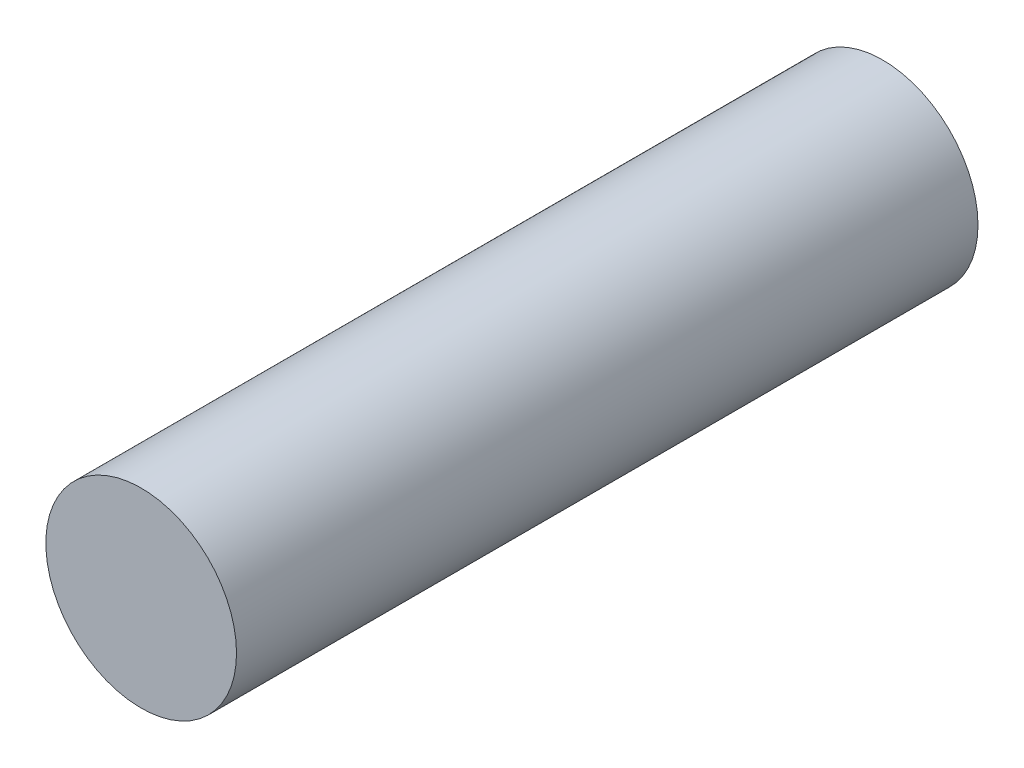
ISO-10303-21;
HEADER;
FILE_DESCRIPTION(('STEP AP214'),'2;1');
FILE_NAME('part.step','',(''),(''),'','','');
FILE_SCHEMA(('AUTOMOTIVE_DESIGN { 1 0 10303 214 1 1 1 1 }'));
ENDSEC;
DATA;
#1=APPLICATION_CONTEXT('core data for automotive mechanical design processes');
#2=APPLICATION_PROTOCOL_DEFINITION('international standard','automotive_design',2000,#1);
#3=PRODUCT_CONTEXT('',#1,'mechanical');
#4=PRODUCT('Part','Part','',(#3));
#5=PRODUCT_RELATED_PRODUCT_CATEGORY('part','',(#4));
#6=PRODUCT_DEFINITION_FORMATION('','',#4);
#7=PRODUCT_DEFINITION_CONTEXT('part definition',#1,'design');
#8=PRODUCT_DEFINITION('design','',#6,#7);
#9=PRODUCT_DEFINITION_SHAPE('','',#8);
#10=(LENGTH_UNIT() NAMED_UNIT(*) SI_UNIT(.MILLI.,.METRE.));
#11=(NAMED_UNIT(*) PLANE_ANGLE_UNIT() SI_UNIT($,.RADIAN.));
#12=(NAMED_UNIT(*) SI_UNIT($,.STERADIAN.) SOLID_ANGLE_UNIT());
#13=UNCERTAINTY_MEASURE_WITH_UNIT(LENGTH_MEASURE(1.E-05),#10,'distance_accuracy_value','');
#14=(GEOMETRIC_REPRESENTATION_CONTEXT(3) GLOBAL_UNCERTAINTY_ASSIGNED_CONTEXT((#13)) GLOBAL_UNIT_ASSIGNED_CONTEXT((#10,
#11,#12)) REPRESENTATION_CONTEXT('',''));
#15=CARTESIAN_POINT('',(0.,0.,0.));
#16=DIRECTION('',(0.,0.,1.));
#17=DIRECTION('',(1.,0.,0.));
#18=AXIS2_PLACEMENT_3D('',#15,#16,#17);
#19=CARTESIAN_POINT('',(0.,0.,70.));
#20=DIRECTION('',(0.,0.,-1.));
#21=DIRECTION('',(-1.,0.,0.));
#22=AXIS2_PLACEMENT_3D('',#19,#20,#21);
#23=CYLINDRICAL_SURFACE('',#22,9.);
#24=CARTESIAN_POINT('',(0.,0.,70.));
#25=DIRECTION('',(0.,0.,1.));
#26=DIRECTION('',(1.,0.,0.));
#27=AXIS2_PLACEMENT_3D('',#24,#25,#26);
#28=CIRCLE('',#27,9.);
#29=CARTESIAN_POINT('',(9.,0.,70.));
#30=VERTEX_POINT('',#29);
#31=EDGE_CURVE('E10',#30,#30,#28,.T.);
#32=ORIENTED_EDGE('',*,*,#31,.F.);
#33=EDGE_LOOP('',(#32));
#34=FACE_BOUND('',#33,.T.);
#35=CARTESIAN_POINT('',(0.,0.,0.));
#36=DIRECTION('',(0.,0.,1.));
#37=DIRECTION('',(1.,0.,0.));
#38=AXIS2_PLACEMENT_3D('',#35,#36,#37);
#39=CIRCLE('',#38,9.);
#40=CARTESIAN_POINT('',(9.,0.,0.));
#41=VERTEX_POINT('',#40);
#42=EDGE_CURVE('E46',#41,#41,#39,.T.);
#43=ORIENTED_EDGE('',*,*,#42,.T.);
#44=EDGE_LOOP('',(#43));
#45=FACE_BOUND('',#44,.T.);
#46=ADVANCED_FACE('F43',(#34,#45),#23,.T.);
#47=CARTESIAN_POINT('',(0.,0.,70.));
#48=DIRECTION('',(0.,0.,1.));
#49=DIRECTION('',(1.,0.,0.));
#50=AXIS2_PLACEMENT_3D('',#47,#48,#49);
#51=PLANE('',#50);
#52=ORIENTED_EDGE('',*,*,#31,.T.);
#53=EDGE_LOOP('',(#52));
#54=FACE_BOUND('',#53,.T.);
#55=ADVANCED_FACE('F58',(#54),#51,.T.);
#56=CARTESIAN_POINT('',(0.,0.,0.));
#57=DIRECTION('',(0.,0.,1.));
#58=DIRECTION('',(1.,0.,0.));
#59=AXIS2_PLACEMENT_3D('',#56,#57,#58);
#60=PLANE('',#59);
#61=ORIENTED_EDGE('',*,*,#42,.F.);
#62=EDGE_LOOP('',(#61));
#63=FACE_BOUND('',#62,.T.);
#64=ADVANCED_FACE('F56',(#63),#60,.F.);
#65=CLOSED_SHELL('',(#46,#55,#64));
#66=MANIFOLD_SOLID_BREP('B2',#65);
#67=ADVANCED_BREP_SHAPE_REPRESENTATION('',(#18,#66),#14);
#68=SHAPE_DEFINITION_REPRESENTATION(#9,#67);
ENDSEC;
END-ISO-10303-21;
